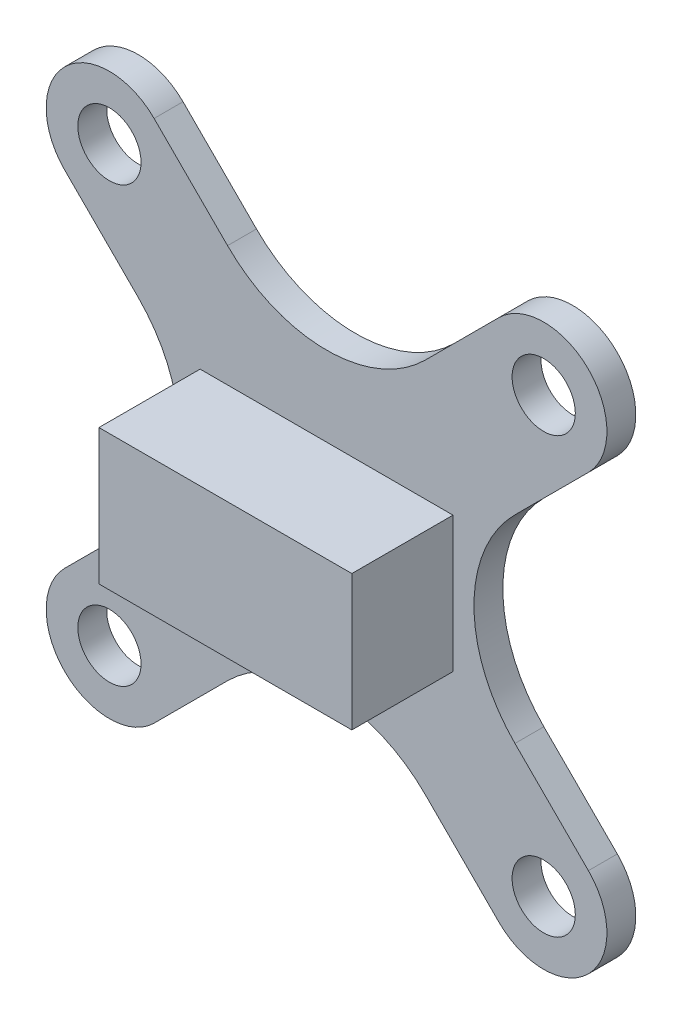
ISO-10303-21;
HEADER;
FILE_DESCRIPTION(('STEP AP214'),'2;1');
FILE_NAME('part.step','',(''),(''),'','','');
FILE_SCHEMA(('AUTOMOTIVE_DESIGN { 1 0 10303 214 1 1 1 1 }'));
ENDSEC;
DATA;
#1=APPLICATION_CONTEXT('core data for automotive mechanical design processes');
#2=APPLICATION_PROTOCOL_DEFINITION('international standard','automotive_design',2000,#1);
#3=PRODUCT_CONTEXT('',#1,'mechanical');
#4=PRODUCT('Part','Part','',(#3));
#5=PRODUCT_RELATED_PRODUCT_CATEGORY('part','',(#4));
#6=PRODUCT_DEFINITION_FORMATION('','',#4);
#7=PRODUCT_DEFINITION_CONTEXT('part definition',#1,'design');
#8=PRODUCT_DEFINITION('design','',#6,#7);
#9=PRODUCT_DEFINITION_SHAPE('','',#8);
#10=(LENGTH_UNIT() NAMED_UNIT(*) SI_UNIT(.MILLI.,.METRE.));
#11=(NAMED_UNIT(*) PLANE_ANGLE_UNIT() SI_UNIT($,.RADIAN.));
#12=(NAMED_UNIT(*) SI_UNIT($,.STERADIAN.) SOLID_ANGLE_UNIT());
#13=UNCERTAINTY_MEASURE_WITH_UNIT(LENGTH_MEASURE(1.E-05),#10,'distance_accuracy_value','');
#14=(GEOMETRIC_REPRESENTATION_CONTEXT(3) GLOBAL_UNCERTAINTY_ASSIGNED_CONTEXT((#13)) GLOBAL_UNIT_ASSIGNED_CONTEXT((#10,
#11,#12)) REPRESENTATION_CONTEXT('',''));
#15=CARTESIAN_POINT('',(0.,0.,0.));
#16=DIRECTION('',(0.,0.,1.));
#17=DIRECTION('',(1.,0.,0.));
#18=AXIS2_PLACEMENT_3D('',#15,#16,#17);
#19=CARTESIAN_POINT('',(0.,0.,0.));
#20=DIRECTION('',(0.,0.,1.));
#21=DIRECTION('',(1.,0.,0.));
#22=AXIS2_PLACEMENT_3D('',#19,#20,#21);
#23=PLANE('',#22);
#24=DIRECTION('',(-0.707106781186548,0.707106781186547,0.));
#25=VECTOR('',#24,1.);
#26=CARTESIAN_POINT('',(-2.47487373415295,-2.47487373415295,0.));
#27=LINE('',#26,#25);
#28=CARTESIAN_POINT('',(-10.4298250225015,5.48007755419563,0.));
#29=VERTEX_POINT('',#28);
#30=CARTESIAN_POINT('',(-14.4956890143243,9.54594154601834,0.));
#31=VERTEX_POINT('',#30);
#32=EDGE_CURVE('E424',#29,#31,#27,.T.);
#33=ORIENTED_EDGE('',*,*,#32,.T.);
#34=CARTESIAN_POINT('',(-12.0208152801714,12.0208152801712,0.));
#35=DIRECTION('',(0.,0.,1.));
#36=DIRECTION('',(1.,0.,0.));
#37=AXIS2_PLACEMENT_3D('',#34,#35,#36);
#38=CIRCLE('',#37,3.5);
#39=CARTESIAN_POINT('',(-9.54594154601845,14.4956890143242,0.));
#40=VERTEX_POINT('',#39);
#41=EDGE_CURVE('E331',#31,#40,#38,.F.);
#42=ORIENTED_EDGE('',*,*,#41,.T.);
#43=DIRECTION('',(0.707106781186549,-0.707106781186546,0.));
#44=VECTOR('',#43,1.);
#45=CARTESIAN_POINT('',(2.47487373415289,2.4748737341529,0.));
#46=LINE('',#45,#44);
#47=CARTESIAN_POINT('',(-5.48007755419572,10.4298250225015,0.));
#48=VERTEX_POINT('',#47);
#49=EDGE_CURVE('E477',#40,#48,#46,.T.);
#50=ORIENTED_EDGE('',*,*,#49,.T.);
#51=CARTESIAN_POINT('',(0.,15.9099025766972,0.));
#52=DIRECTION('',(0.,0.,1.));
#53=DIRECTION('',(1.,0.,0.));
#54=AXIS2_PLACEMENT_3D('',#51,#52,#53);
#55=CIRCLE('',#54,7.74999999999999);
#56=CARTESIAN_POINT('',(5.48007755419572,10.4298250225015,0.));
#57=VERTEX_POINT('',#56);
#58=EDGE_CURVE('E478',#48,#57,#55,.T.);
#59=ORIENTED_EDGE('',*,*,#58,.T.);
#60=DIRECTION('',(-0.707106781186551,-0.707106781186544,0.));
#61=VECTOR('',#60,1.);
#62=CARTESIAN_POINT('',(-2.47487373415291,2.47487373415294,0.));
#63=LINE('',#62,#61);
#64=CARTESIAN_POINT('',(9.54594154601845,14.4956890143242,0.));
#65=VERTEX_POINT('',#64);
#66=EDGE_CURVE('E472',#65,#57,#63,.T.);
#67=ORIENTED_EDGE('',*,*,#66,.F.);
#68=CARTESIAN_POINT('',(12.0208152801714,12.0208152801712,0.));
#69=DIRECTION('',(0.,0.,1.));
#70=DIRECTION('',(1.,0.,0.));
#71=AXIS2_PLACEMENT_3D('',#68,#69,#70);
#72=CIRCLE('',#71,3.5);
#73=CARTESIAN_POINT('',(14.4956890143243,9.54594154601834,0.));
#74=VERTEX_POINT('',#73);
#75=EDGE_CURVE('E470',#74,#65,#72,.T.);
#76=ORIENTED_EDGE('',*,*,#75,.F.);
#77=DIRECTION('',(0.70710678118657,0.707106781186525,0.));
#78=VECTOR('',#77,1.);
#79=CARTESIAN_POINT('',(2.4748737341525,-2.47487373415266,0.));
#80=LINE('',#79,#78);
#81=CARTESIAN_POINT('',(10.4298250225015,5.4800775541958,0.));
#82=VERTEX_POINT('',#81);
#83=EDGE_CURVE('E463',#82,#74,#80,.T.);
#84=ORIENTED_EDGE('',*,*,#83,.F.);
#85=CARTESIAN_POINT('',(15.9099025766973,1.28369537222284E-13,0.));
#86=DIRECTION('',(0.,0.,1.));
#87=DIRECTION('',(1.,0.,0.));
#88=AXIS2_PLACEMENT_3D('',#85,#86,#87);
#89=CIRCLE('',#88,7.74999999999999);
#90=CARTESIAN_POINT('',(10.4298250225015,-5.48007755419564,0.));
#91=VERTEX_POINT('',#90);
#92=EDGE_CURVE('E458',#82,#91,#89,.T.);
#93=ORIENTED_EDGE('',*,*,#92,.T.);
#94=DIRECTION('',(0.707106781186548,-0.707106781186547,0.));
#95=VECTOR('',#94,1.);
#96=CARTESIAN_POINT('',(2.47487373415294,2.47487373415295,0.));
#97=LINE('',#96,#95);
#98=CARTESIAN_POINT('',(14.4956890143243,-9.54594154601834,0.));
#99=VERTEX_POINT('',#98);
#100=EDGE_CURVE('E457',#91,#99,#97,.T.);
#101=ORIENTED_EDGE('',*,*,#100,.T.);
#102=CARTESIAN_POINT('',(12.0208152801714,-12.0208152801712,0.));
#103=DIRECTION('',(0.,0.,1.));
#104=DIRECTION('',(1.,0.,0.));
#105=AXIS2_PLACEMENT_3D('',#102,#103,#104);
#106=CIRCLE('',#105,3.5);
#107=CARTESIAN_POINT('',(9.54594154601845,-14.4956890143242,0.));
#108=VERTEX_POINT('',#107);
#109=EDGE_CURVE('E451',#99,#108,#106,.F.);
#110=ORIENTED_EDGE('',*,*,#109,.T.);
#111=DIRECTION('',(-0.707106781186551,0.707106781186544,0.));
#112=VECTOR('',#111,1.);
#113=CARTESIAN_POINT('',(-2.47487373415291,-2.47487373415294,0.));
#114=LINE('',#113,#112);
#115=CARTESIAN_POINT('',(5.48007755419572,-10.4298250225015,0.));
#116=VERTEX_POINT('',#115);
#117=EDGE_CURVE('E447',#108,#116,#114,.T.);
#118=ORIENTED_EDGE('',*,*,#117,.T.);
#119=CARTESIAN_POINT('',(0.,-15.9099025766973,0.));
#120=DIRECTION('',(0.,0.,1.));
#121=DIRECTION('',(1.,0.,0.));
#122=AXIS2_PLACEMENT_3D('',#119,#120,#121);
#123=CIRCLE('',#122,7.74999999999999);
#124=CARTESIAN_POINT('',(-5.48007755419571,-10.4298250225015,0.));
#125=VERTEX_POINT('',#124);
#126=EDGE_CURVE('E441',#125,#116,#123,.F.);
#127=ORIENTED_EDGE('',*,*,#126,.F.);
#128=DIRECTION('',(0.707106781186551,0.707106781186544,0.));
#129=VECTOR('',#128,1.);
#130=CARTESIAN_POINT('',(2.47487373415292,-2.47487373415295,0.));
#131=LINE('',#130,#129);
#132=CARTESIAN_POINT('',(-9.54594154601845,-14.4956890143242,0.));
#133=VERTEX_POINT('',#132);
#134=EDGE_CURVE('E439',#133,#125,#131,.T.);
#135=ORIENTED_EDGE('',*,*,#134,.F.);
#136=CARTESIAN_POINT('',(-12.0208152801714,-12.0208152801712,0.));
#137=DIRECTION('',(0.,0.,1.));
#138=DIRECTION('',(1.,0.,0.));
#139=AXIS2_PLACEMENT_3D('',#136,#137,#138);
#140=CIRCLE('',#139,3.49999999999999);
#141=CARTESIAN_POINT('',(-14.4956890143243,-9.54594154601835,0.));
#142=VERTEX_POINT('',#141);
#143=EDGE_CURVE('E436',#142,#133,#140,.T.);
#144=ORIENTED_EDGE('',*,*,#143,.F.);
#145=DIRECTION('',(-0.70710678118657,-0.707106781186525,0.));
#146=VECTOR('',#145,1.);
#147=CARTESIAN_POINT('',(-2.4748737341525,2.47487373415265,0.));
#148=LINE('',#147,#146);
#149=CARTESIAN_POINT('',(-10.4298250225015,-5.48007755419581,0.));
#150=VERTEX_POINT('',#149);
#151=EDGE_CURVE('E435',#150,#142,#148,.T.);
#152=ORIENTED_EDGE('',*,*,#151,.F.);
#153=CARTESIAN_POINT('',(-15.9099025766973,-1.35308431126191E-13,0.));
#154=DIRECTION('',(0.,0.,1.));
#155=DIRECTION('',(1.,0.,0.));
#156=AXIS2_PLACEMENT_3D('',#153,#154,#155);
#157=CIRCLE('',#156,7.75);
#158=EDGE_CURVE('E428',#29,#150,#157,.F.);
#159=ORIENTED_EDGE('',*,*,#158,.F.);
#160=EDGE_LOOP('',(#33,#42,#50,#59,#67,#76,#84,#93,#101,#110,#118,#127,#135,#144,#152,#159));
#161=FACE_BOUND('',#160,.T.);
#162=CARTESIAN_POINT('',(12.0208152801714,-12.0208152801712,0.));
#163=DIRECTION('',(0.,0.,1.));
#164=DIRECTION('',(1.,0.,0.));
#165=AXIS2_PLACEMENT_3D('',#162,#163,#164);
#166=CIRCLE('',#165,1.75);
#167=CARTESIAN_POINT('',(13.7708152801714,-12.0208152801712,0.));
#168=VERTEX_POINT('',#167);
#169=EDGE_CURVE('E419',#168,#168,#166,.T.);
#170=ORIENTED_EDGE('',*,*,#169,.T.);
#171=EDGE_LOOP('',(#170));
#172=FACE_BOUND('',#171,.T.);
#173=CARTESIAN_POINT('',(12.0208152801714,12.0208152801712,0.));
#174=DIRECTION('',(0.,0.,1.));
#175=DIRECTION('',(1.,0.,0.));
#176=AXIS2_PLACEMENT_3D('',#173,#174,#175);
#177=CIRCLE('',#176,1.75);
#178=CARTESIAN_POINT('',(13.7708152801714,12.0208152801712,0.));
#179=VERTEX_POINT('',#178);
#180=EDGE_CURVE('E418',#179,#179,#177,.F.);
#181=ORIENTED_EDGE('',*,*,#180,.F.);
#182=EDGE_LOOP('',(#181));
#183=FACE_BOUND('',#182,.T.);
#184=CARTESIAN_POINT('',(-12.0208152801714,12.0208152801713,0.));
#185=DIRECTION('',(0.,0.,1.));
#186=DIRECTION('',(1.,0.,0.));
#187=AXIS2_PLACEMENT_3D('',#184,#185,#186);
#188=CIRCLE('',#187,1.74999999999998);
#189=CARTESIAN_POINT('',(-10.2708152801714,12.0208152801713,0.));
#190=VERTEX_POINT('',#189);
#191=EDGE_CURVE('E411',#190,#190,#188,.T.);
#192=ORIENTED_EDGE('',*,*,#191,.T.);
#193=EDGE_LOOP('',(#192));
#194=FACE_BOUND('',#193,.T.);
#195=CARTESIAN_POINT('',(-12.0208152801714,-12.0208152801712,0.));
#196=DIRECTION('',(0.,0.,1.));
#197=DIRECTION('',(1.,0.,0.));
#198=AXIS2_PLACEMENT_3D('',#195,#196,#197);
#199=CIRCLE('',#198,1.75);
#200=CARTESIAN_POINT('',(-10.2708152801714,-12.0208152801712,0.));
#201=VERTEX_POINT('',#200);
#202=EDGE_CURVE('E327',#201,#201,#199,.F.);
#203=ORIENTED_EDGE('',*,*,#202,.F.);
#204=EDGE_LOOP('',(#203));
#205=FACE_BOUND('',#204,.T.);
#206=DIRECTION('',(0.,-1.,0.));
#207=VECTOR('',#206,1.);
#208=CARTESIAN_POINT('',(2.5,0.,0.));
#209=LINE('',#208,#207);
#210=CARTESIAN_POINT('',(2.5,2.,0.));
#211=VERTEX_POINT('',#210);
#212=CARTESIAN_POINT('',(2.5,-2.,0.));
#213=VERTEX_POINT('',#212);
#214=EDGE_CURVE('E93',#211,#213,#209,.T.);
#215=ORIENTED_EDGE('',*,*,#214,.F.);
#216=DIRECTION('',(1.,0.,0.));
#217=VECTOR('',#216,1.);
#218=CARTESIAN_POINT('',(0.,2.,0.));
#219=LINE('',#218,#217);
#220=CARTESIAN_POINT('',(-2.5,2.,0.));
#221=VERTEX_POINT('',#220);
#222=EDGE_CURVE('E252',#221,#211,#219,.T.);
#223=ORIENTED_EDGE('',*,*,#222,.F.);
#224=DIRECTION('',(0.,-1.,0.));
#225=VECTOR('',#224,1.);
#226=CARTESIAN_POINT('',(-2.5,0.,0.));
#227=LINE('',#226,#225);
#228=CARTESIAN_POINT('',(-2.5,-2.,0.));
#229=VERTEX_POINT('',#228);
#230=EDGE_CURVE('E264',#221,#229,#227,.T.);
#231=ORIENTED_EDGE('',*,*,#230,.T.);
#232=DIRECTION('',(1.,0.,0.));
#233=VECTOR('',#232,1.);
#234=CARTESIAN_POINT('',(0.,-2.,0.));
#235=LINE('',#234,#233);
#236=EDGE_CURVE('E261',#229,#213,#235,.T.);
#237=ORIENTED_EDGE('',*,*,#236,.T.);
#238=EDGE_LOOP('',(#215,#223,#231,#237));
#239=FACE_BOUND('',#238,.T.);
#240=ADVANCED_FACE('F73',(#161,#172,#183,#194,#205,#239),#23,.F.);
#241=CARTESIAN_POINT('',(-2.47487373415295,-2.47487373415295,1.6));
#242=DIRECTION('',(-0.707106781186547,-0.707106781186548,0.));
#243=DIRECTION('',(0.707106781186548,-0.707106781186547,0.));
#244=AXIS2_PLACEMENT_3D('',#241,#242,#243);
#245=PLANE('',#244);
#246=ORIENTED_EDGE('',*,*,#32,.F.);
#247=DIRECTION('',(0.,0.,-1.));
#248=VECTOR('',#247,1.);
#249=CARTESIAN_POINT('',(-10.4298250225015,5.48007755419563,1.6));
#250=LINE('',#249,#248);
#251=CARTESIAN_POINT('',(-10.4298250225015,5.48007755419563,1.6));
#252=VERTEX_POINT('',#251);
#253=EDGE_CURVE('E12',#252,#29,#250,.T.);
#254=ORIENTED_EDGE('',*,*,#253,.F.);
#255=DIRECTION('',(-0.707106781186548,0.707106781186547,0.));
#256=VECTOR('',#255,1.);
#257=CARTESIAN_POINT('',(-2.47487373415295,-2.47487373415295,1.6));
#258=LINE('',#257,#256);
#259=CARTESIAN_POINT('',(-14.4956890143243,9.54594154601834,1.6));
#260=VERTEX_POINT('',#259);
#261=EDGE_CURVE('E347',#252,#260,#258,.T.);
#262=ORIENTED_EDGE('',*,*,#261,.T.);
#263=DIRECTION('',(0.,0.,-1.));
#264=VECTOR('',#263,1.);
#265=CARTESIAN_POINT('',(-14.4956890143243,9.54594154601834,1.6));
#266=LINE('',#265,#264);
#267=EDGE_CURVE('E407',#260,#31,#266,.T.);
#268=ORIENTED_EDGE('',*,*,#267,.T.);
#269=EDGE_LOOP('',(#246,#254,#262,#268));
#270=FACE_BOUND('',#269,.T.);
#271=ADVANCED_FACE('F550',(#270),#245,.T.);
#272=CARTESIAN_POINT('',(-15.9099025766973,-1.35308431126191E-13,1.6));
#273=DIRECTION('',(0.,0.,-1.));
#274=DIRECTION('',(-1.,0.,0.));
#275=AXIS2_PLACEMENT_3D('',#272,#273,#274);
#276=CYLINDRICAL_SURFACE('',#275,7.75);
#277=ORIENTED_EDGE('',*,*,#158,.T.);
#278=DIRECTION('',(0.,0.,-1.));
#279=VECTOR('',#278,1.);
#280=CARTESIAN_POINT('',(-10.4298250225015,-5.48007755419581,1.6));
#281=LINE('',#280,#279);
#282=CARTESIAN_POINT('',(-10.4298250225015,-5.48007755419581,1.6));
#283=VERTEX_POINT('',#282);
#284=EDGE_CURVE('E83',#283,#150,#281,.T.);
#285=ORIENTED_EDGE('',*,*,#284,.F.);
#286=CARTESIAN_POINT('',(-15.9099025766973,-1.35308431126191E-13,1.6));
#287=DIRECTION('',(0.,0.,1.));
#288=DIRECTION('',(1.,0.,0.));
#289=AXIS2_PLACEMENT_3D('',#286,#287,#288);
#290=CIRCLE('',#289,7.75);
#291=EDGE_CURVE('E348',#252,#283,#290,.F.);
#292=ORIENTED_EDGE('',*,*,#291,.F.);
#293=ORIENTED_EDGE('',*,*,#253,.T.);
#294=EDGE_LOOP('',(#277,#285,#292,#293));
#295=FACE_BOUND('',#294,.T.);
#296=ADVANCED_FACE('F541',(#295),#276,.F.);
#297=CARTESIAN_POINT('',(-2.4748737341525,2.47487373415265,1.6));
#298=DIRECTION('',(0.707106781186525,-0.70710678118657,0.));
#299=DIRECTION('',(0.70710678118657,0.707106781186525,0.));
#300=AXIS2_PLACEMENT_3D('',#297,#298,#299);
#301=PLANE('',#300);
#302=ORIENTED_EDGE('',*,*,#151,.T.);
#303=DIRECTION('',(0.,0.,-1.));
#304=VECTOR('',#303,1.);
#305=CARTESIAN_POINT('',(-14.4956890143243,-9.54594154601835,1.6));
#306=LINE('',#305,#304);
#307=CARTESIAN_POINT('',(-14.4956890143243,-9.54594154601835,1.6));
#308=VERTEX_POINT('',#307);
#309=EDGE_CURVE('E530',#308,#142,#306,.T.);
#310=ORIENTED_EDGE('',*,*,#309,.F.);
#311=DIRECTION('',(-0.70710678118657,-0.707106781186525,0.));
#312=VECTOR('',#311,1.);
#313=CARTESIAN_POINT('',(-2.4748737341525,2.47487373415265,1.6));
#314=LINE('',#313,#312);
#315=EDGE_CURVE('E353',#283,#308,#314,.T.);
#316=ORIENTED_EDGE('',*,*,#315,.F.);
#317=ORIENTED_EDGE('',*,*,#284,.T.);
#318=EDGE_LOOP('',(#302,#310,#316,#317));
#319=FACE_BOUND('',#318,.T.);
#320=ADVANCED_FACE('F536',(#319),#301,.F.);
#321=CARTESIAN_POINT('',(-12.0208152801714,-12.0208152801712,1.6));
#322=DIRECTION('',(0.,0.,-1.));
#323=DIRECTION('',(-1.,0.,0.));
#324=AXIS2_PLACEMENT_3D('',#321,#322,#323);
#325=CYLINDRICAL_SURFACE('',#324,3.49999999999999);
#326=ORIENTED_EDGE('',*,*,#143,.T.);
#327=DIRECTION('',(0.,0.,-1.));
#328=VECTOR('',#327,1.);
#329=CARTESIAN_POINT('',(-9.54594154601845,-14.4956890143242,1.6));
#330=LINE('',#329,#328);
#331=CARTESIAN_POINT('',(-9.54594154601845,-14.4956890143242,1.6));
#332=VERTEX_POINT('',#331);
#333=EDGE_CURVE('E522',#332,#133,#330,.T.);
#334=ORIENTED_EDGE('',*,*,#333,.F.);
#335=CARTESIAN_POINT('',(-12.0208152801714,-12.0208152801712,1.6));
#336=DIRECTION('',(0.,0.,1.));
#337=DIRECTION('',(1.,0.,0.));
#338=AXIS2_PLACEMENT_3D('',#335,#336,#337);
#339=CIRCLE('',#338,3.49999999999999);
#340=EDGE_CURVE('E360',#308,#332,#339,.T.);
#341=ORIENTED_EDGE('',*,*,#340,.F.);
#342=ORIENTED_EDGE('',*,*,#309,.T.);
#343=EDGE_LOOP('',(#326,#334,#341,#342));
#344=FACE_BOUND('',#343,.T.);
#345=ADVANCED_FACE('F594',(#344),#325,.T.);
#346=CARTESIAN_POINT('',(2.47487373415292,-2.47487373415295,1.6));
#347=DIRECTION('',(-0.707106781186544,0.707106781186551,0.));
#348=DIRECTION('',(-0.707106781186551,-0.707106781186544,0.));
#349=AXIS2_PLACEMENT_3D('',#346,#347,#348);
#350=PLANE('',#349);
#351=ORIENTED_EDGE('',*,*,#134,.T.);
#352=DIRECTION('',(0.,0.,-1.));
#353=VECTOR('',#352,1.);
#354=CARTESIAN_POINT('',(-5.48007755419571,-10.4298250225015,1.6));
#355=LINE('',#354,#353);
#356=CARTESIAN_POINT('',(-5.48007755419571,-10.4298250225015,1.6));
#357=VERTEX_POINT('',#356);
#358=EDGE_CURVE('E524',#357,#125,#355,.T.);
#359=ORIENTED_EDGE('',*,*,#358,.F.);
#360=DIRECTION('',(0.707106781186551,0.707106781186544,0.));
#361=VECTOR('',#360,1.);
#362=CARTESIAN_POINT('',(2.47487373415292,-2.47487373415295,1.6));
#363=LINE('',#362,#361);
#364=EDGE_CURVE('E362',#332,#357,#363,.T.);
#365=ORIENTED_EDGE('',*,*,#364,.F.);
#366=ORIENTED_EDGE('',*,*,#333,.T.);
#367=EDGE_LOOP('',(#351,#359,#365,#366));
#368=FACE_BOUND('',#367,.T.);
#369=ADVANCED_FACE('F595',(#368),#350,.F.);
#370=CARTESIAN_POINT('',(0.,-15.9099025766973,1.6));
#371=DIRECTION('',(0.,0.,-1.));
#372=DIRECTION('',(-1.,0.,0.));
#373=AXIS2_PLACEMENT_3D('',#370,#371,#372);
#374=CYLINDRICAL_SURFACE('',#373,7.74999999999999);
#375=ORIENTED_EDGE('',*,*,#126,.T.);
#376=DIRECTION('',(0.,0.,-1.));
#377=VECTOR('',#376,1.);
#378=CARTESIAN_POINT('',(5.48007755419572,-10.4298250225015,1.6));
#379=LINE('',#378,#377);
#380=CARTESIAN_POINT('',(5.48007755419572,-10.4298250225015,1.6));
#381=VERTEX_POINT('',#380);
#382=EDGE_CURVE('E517',#381,#116,#379,.T.);
#383=ORIENTED_EDGE('',*,*,#382,.F.);
#384=CARTESIAN_POINT('',(0.,-15.9099025766973,1.6));
#385=DIRECTION('',(0.,0.,1.));
#386=DIRECTION('',(1.,0.,0.));
#387=AXIS2_PLACEMENT_3D('',#384,#385,#386);
#388=CIRCLE('',#387,7.74999999999999);
#389=EDGE_CURVE('E368',#357,#381,#388,.F.);
#390=ORIENTED_EDGE('',*,*,#389,.F.);
#391=ORIENTED_EDGE('',*,*,#358,.T.);
#392=EDGE_LOOP('',(#375,#383,#390,#391));
#393=FACE_BOUND('',#392,.T.);
#394=ADVANCED_FACE('F587',(#393),#374,.F.);
#395=CARTESIAN_POINT('',(-2.47487373415291,-2.47487373415294,1.6));
#396=DIRECTION('',(-0.707106781186545,-0.707106781186551,0.));
#397=DIRECTION('',(0.707106781186551,-0.707106781186545,0.));
#398=AXIS2_PLACEMENT_3D('',#395,#396,#397);
#399=PLANE('',#398);
#400=ORIENTED_EDGE('',*,*,#117,.F.);
#401=DIRECTION('',(0.,0.,-1.));
#402=VECTOR('',#401,1.);
#403=CARTESIAN_POINT('',(9.54594154601845,-14.4956890143242,1.6));
#404=LINE('',#403,#402);
#405=CARTESIAN_POINT('',(9.54594154601845,-14.4956890143242,1.6));
#406=VERTEX_POINT('',#405);
#407=EDGE_CURVE('E513',#406,#108,#404,.T.);
#408=ORIENTED_EDGE('',*,*,#407,.F.);
#409=DIRECTION('',(-0.707106781186551,0.707106781186544,0.));
#410=VECTOR('',#409,1.);
#411=CARTESIAN_POINT('',(-2.47487373415291,-2.47487373415294,1.6));
#412=LINE('',#411,#410);
#413=EDGE_CURVE('E369',#406,#381,#412,.T.);
#414=ORIENTED_EDGE('',*,*,#413,.T.);
#415=ORIENTED_EDGE('',*,*,#382,.T.);
#416=EDGE_LOOP('',(#400,#408,#414,#415));
#417=FACE_BOUND('',#416,.T.);
#418=ADVANCED_FACE('F588',(#417),#399,.T.);
#419=CARTESIAN_POINT('',(12.0208152801714,-12.0208152801712,1.6));
#420=DIRECTION('',(0.,0.,-1.));
#421=DIRECTION('',(-1.,0.,0.));
#422=AXIS2_PLACEMENT_3D('',#419,#420,#421);
#423=CYLINDRICAL_SURFACE('',#422,3.5);
#424=ORIENTED_EDGE('',*,*,#109,.F.);
#425=DIRECTION('',(0.,0.,-1.));
#426=VECTOR('',#425,1.);
#427=CARTESIAN_POINT('',(14.4956890143243,-9.54594154601834,1.6));
#428=LINE('',#427,#426);
#429=CARTESIAN_POINT('',(14.4956890143243,-9.54594154601834,1.6));
#430=VERTEX_POINT('',#429);
#431=EDGE_CURVE('E515',#430,#99,#428,.T.);
#432=ORIENTED_EDGE('',*,*,#431,.F.);
#433=CARTESIAN_POINT('',(12.0208152801714,-12.0208152801712,1.6));
#434=DIRECTION('',(0.,0.,1.));
#435=DIRECTION('',(1.,0.,0.));
#436=AXIS2_PLACEMENT_3D('',#433,#434,#435);
#437=CIRCLE('',#436,3.5);
#438=EDGE_CURVE('E373',#430,#406,#437,.F.);
#439=ORIENTED_EDGE('',*,*,#438,.T.);
#440=ORIENTED_EDGE('',*,*,#407,.T.);
#441=EDGE_LOOP('',(#424,#432,#439,#440));
#442=FACE_BOUND('',#441,.T.);
#443=ADVANCED_FACE('F582',(#442),#423,.T.);
#444=CARTESIAN_POINT('',(2.47487373415294,2.47487373415295,1.6));
#445=DIRECTION('',(0.707106781186547,0.707106781186548,0.));
#446=DIRECTION('',(-0.707106781186548,0.707106781186547,0.));
#447=AXIS2_PLACEMENT_3D('',#444,#445,#446);
#448=PLANE('',#447);
#449=ORIENTED_EDGE('',*,*,#100,.F.);
#450=DIRECTION('',(0.,0.,-1.));
#451=VECTOR('',#450,1.);
#452=CARTESIAN_POINT('',(10.4298250225015,-5.48007755419564,1.6));
#453=LINE('',#452,#451);
#454=CARTESIAN_POINT('',(10.4298250225015,-5.48007755419564,1.6));
#455=VERTEX_POINT('',#454);
#456=EDGE_CURVE('E508',#455,#91,#453,.T.);
#457=ORIENTED_EDGE('',*,*,#456,.F.);
#458=DIRECTION('',(0.707106781186548,-0.707106781186547,0.));
#459=VECTOR('',#458,1.);
#460=CARTESIAN_POINT('',(2.47487373415294,2.47487373415295,1.6));
#461=LINE('',#460,#459);
#462=EDGE_CURVE('E380',#455,#430,#461,.T.);
#463=ORIENTED_EDGE('',*,*,#462,.T.);
#464=ORIENTED_EDGE('',*,*,#431,.T.);
#465=EDGE_LOOP('',(#449,#457,#463,#464));
#466=FACE_BOUND('',#465,.T.);
#467=ADVANCED_FACE('F580',(#466),#448,.T.);
#468=CARTESIAN_POINT('',(15.9099025766973,1.28369537222284E-13,1.6));
#469=DIRECTION('',(0.,0.,-1.));
#470=DIRECTION('',(-1.,0.,0.));
#471=AXIS2_PLACEMENT_3D('',#468,#469,#470);
#472=CYLINDRICAL_SURFACE('',#471,7.74999999999999);
#473=ORIENTED_EDGE('',*,*,#92,.F.);
#474=DIRECTION('',(0.,0.,-1.));
#475=VECTOR('',#474,1.);
#476=CARTESIAN_POINT('',(10.4298250225015,5.4800775541958,1.6));
#477=LINE('',#476,#475);
#478=CARTESIAN_POINT('',(10.4298250225015,5.4800775541958,1.6));
#479=VERTEX_POINT('',#478);
#480=EDGE_CURVE('E509',#479,#82,#477,.T.);
#481=ORIENTED_EDGE('',*,*,#480,.F.);
#482=CARTESIAN_POINT('',(15.9099025766973,1.28369537222284E-13,1.6));
#483=DIRECTION('',(0.,0.,1.));
#484=DIRECTION('',(1.,0.,0.));
#485=AXIS2_PLACEMENT_3D('',#482,#483,#484);
#486=CIRCLE('',#485,7.74999999999999);
#487=EDGE_CURVE('E381',#479,#455,#486,.T.);
#488=ORIENTED_EDGE('',*,*,#487,.T.);
#489=ORIENTED_EDGE('',*,*,#456,.T.);
#490=EDGE_LOOP('',(#473,#481,#488,#489));
#491=FACE_BOUND('',#490,.T.);
#492=ADVANCED_FACE('F573',(#491),#472,.F.);
#493=CARTESIAN_POINT('',(2.4748737341525,-2.47487373415266,1.6));
#494=DIRECTION('',(-0.707106781186525,0.70710678118657,0.));
#495=DIRECTION('',(-0.70710678118657,-0.707106781186525,0.));
#496=AXIS2_PLACEMENT_3D('',#493,#494,#495);
#497=PLANE('',#496);
#498=ORIENTED_EDGE('',*,*,#83,.T.);
#499=DIRECTION('',(0.,0.,-1.));
#500=VECTOR('',#499,1.);
#501=CARTESIAN_POINT('',(14.4956890143243,9.54594154601834,1.6));
#502=LINE('',#501,#500);
#503=CARTESIAN_POINT('',(14.4956890143243,9.54594154601834,1.6));
#504=VERTEX_POINT('',#503);
#505=EDGE_CURVE('E505',#504,#74,#502,.T.);
#506=ORIENTED_EDGE('',*,*,#505,.F.);
#507=DIRECTION('',(0.70710678118657,0.707106781186525,0.));
#508=VECTOR('',#507,1.);
#509=CARTESIAN_POINT('',(2.4748737341525,-2.47487373415266,1.6));
#510=LINE('',#509,#508);
#511=EDGE_CURVE('E384',#479,#504,#510,.T.);
#512=ORIENTED_EDGE('',*,*,#511,.F.);
#513=ORIENTED_EDGE('',*,*,#480,.T.);
#514=EDGE_LOOP('',(#498,#506,#512,#513));
#515=FACE_BOUND('',#514,.T.);
#516=ADVANCED_FACE('F571',(#515),#497,.F.);
#517=CARTESIAN_POINT('',(12.0208152801714,12.0208152801712,1.6));
#518=DIRECTION('',(0.,0.,-1.));
#519=DIRECTION('',(-1.,0.,0.));
#520=AXIS2_PLACEMENT_3D('',#517,#518,#519);
#521=CYLINDRICAL_SURFACE('',#520,3.5);
#522=ORIENTED_EDGE('',*,*,#75,.T.);
#523=DIRECTION('',(0.,0.,-1.));
#524=VECTOR('',#523,1.);
#525=CARTESIAN_POINT('',(9.54594154601845,14.4956890143242,1.6));
#526=LINE('',#525,#524);
#527=CARTESIAN_POINT('',(9.54594154601845,14.4956890143242,1.6));
#528=VERTEX_POINT('',#527);
#529=EDGE_CURVE('E499',#528,#65,#526,.T.);
#530=ORIENTED_EDGE('',*,*,#529,.F.);
#531=CARTESIAN_POINT('',(12.0208152801714,12.0208152801712,1.6));
#532=DIRECTION('',(0.,0.,1.));
#533=DIRECTION('',(1.,0.,0.));
#534=AXIS2_PLACEMENT_3D('',#531,#532,#533);
#535=CIRCLE('',#534,3.5);
#536=EDGE_CURVE('E386',#504,#528,#535,.T.);
#537=ORIENTED_EDGE('',*,*,#536,.F.);
#538=ORIENTED_EDGE('',*,*,#505,.T.);
#539=EDGE_LOOP('',(#522,#530,#537,#538));
#540=FACE_BOUND('',#539,.T.);
#541=ADVANCED_FACE('F566',(#540),#521,.T.);
#542=CARTESIAN_POINT('',(-2.47487373415291,2.47487373415294,1.6));
#543=DIRECTION('',(0.707106781186545,-0.707106781186551,0.));
#544=DIRECTION('',(0.707106781186551,0.707106781186545,0.));
#545=AXIS2_PLACEMENT_3D('',#542,#543,#544);
#546=PLANE('',#545);
#547=ORIENTED_EDGE('',*,*,#66,.T.);
#548=DIRECTION('',(0.,0.,-1.));
#549=VECTOR('',#548,1.);
#550=CARTESIAN_POINT('',(5.48007755419572,10.4298250225015,1.6));
#551=LINE('',#550,#549);
#552=CARTESIAN_POINT('',(5.48007755419572,10.4298250225015,1.6));
#553=VERTEX_POINT('',#552);
#554=EDGE_CURVE('E494',#553,#57,#551,.T.);
#555=ORIENTED_EDGE('',*,*,#554,.F.);
#556=DIRECTION('',(-0.707106781186551,-0.707106781186544,0.));
#557=VECTOR('',#556,1.);
#558=CARTESIAN_POINT('',(-2.47487373415291,2.47487373415294,1.6));
#559=LINE('',#558,#557);
#560=EDGE_CURVE('E392',#528,#553,#559,.T.);
#561=ORIENTED_EDGE('',*,*,#560,.F.);
#562=ORIENTED_EDGE('',*,*,#529,.T.);
#563=EDGE_LOOP('',(#547,#555,#561,#562));
#564=FACE_BOUND('',#563,.T.);
#565=ADVANCED_FACE('F561',(#564),#546,.F.);
#566=CARTESIAN_POINT('',(0.,15.9099025766972,1.6));
#567=DIRECTION('',(0.,0.,-1.));
#568=DIRECTION('',(-1.,0.,0.));
#569=AXIS2_PLACEMENT_3D('',#566,#567,#568);
#570=CYLINDRICAL_SURFACE('',#569,7.74999999999999);
#571=ORIENTED_EDGE('',*,*,#58,.F.);
#572=DIRECTION('',(0.,0.,-1.));
#573=VECTOR('',#572,1.);
#574=CARTESIAN_POINT('',(-5.48007755419572,10.4298250225015,1.6));
#575=LINE('',#574,#573);
#576=CARTESIAN_POINT('',(-5.48007755419572,10.4298250225015,1.6));
#577=VERTEX_POINT('',#576);
#578=EDGE_CURVE('E495',#577,#48,#575,.T.);
#579=ORIENTED_EDGE('',*,*,#578,.F.);
#580=CARTESIAN_POINT('',(0.,15.9099025766972,1.6));
#581=DIRECTION('',(0.,0.,1.));
#582=DIRECTION('',(1.,0.,0.));
#583=AXIS2_PLACEMENT_3D('',#580,#581,#582);
#584=CIRCLE('',#583,7.74999999999999);
#585=EDGE_CURVE('E399',#577,#553,#584,.T.);
#586=ORIENTED_EDGE('',*,*,#585,.T.);
#587=ORIENTED_EDGE('',*,*,#554,.T.);
#588=EDGE_LOOP('',(#571,#579,#586,#587));
#589=FACE_BOUND('',#588,.T.);
#590=ADVANCED_FACE('F558',(#589),#570,.F.);
#591=CARTESIAN_POINT('',(2.47487373415289,2.4748737341529,1.6));
#592=DIRECTION('',(0.707106781186546,0.707106781186549,0.));
#593=DIRECTION('',(-0.707106781186549,0.707106781186546,0.));
#594=AXIS2_PLACEMENT_3D('',#591,#592,#593);
#595=PLANE('',#594);
#596=ORIENTED_EDGE('',*,*,#49,.F.);
#597=DIRECTION('',(0.,0.,-1.));
#598=VECTOR('',#597,1.);
#599=CARTESIAN_POINT('',(-9.54594154601845,14.4956890143242,1.6));
#600=LINE('',#599,#598);
#601=CARTESIAN_POINT('',(-9.54594154601845,14.4956890143242,1.6));
#602=VERTEX_POINT('',#601);
#603=EDGE_CURVE('E487',#602,#40,#600,.T.);
#604=ORIENTED_EDGE('',*,*,#603,.F.);
#605=DIRECTION('',(0.707106781186549,-0.707106781186546,0.));
#606=VECTOR('',#605,1.);
#607=CARTESIAN_POINT('',(2.47487373415289,2.4748737341529,1.6));
#608=LINE('',#607,#606);
#609=EDGE_CURVE('E397',#602,#577,#608,.T.);
#610=ORIENTED_EDGE('',*,*,#609,.T.);
#611=ORIENTED_EDGE('',*,*,#578,.T.);
#612=EDGE_LOOP('',(#596,#604,#610,#611));
#613=FACE_BOUND('',#612,.T.);
#614=ADVANCED_FACE('F553',(#613),#595,.T.);
#615=CARTESIAN_POINT('',(-12.0208152801714,12.0208152801712,1.6));
#616=DIRECTION('',(0.,0.,-1.));
#617=DIRECTION('',(-1.,0.,0.));
#618=AXIS2_PLACEMENT_3D('',#615,#616,#617);
#619=CYLINDRICAL_SURFACE('',#618,3.5);
#620=ORIENTED_EDGE('',*,*,#41,.F.);
#621=ORIENTED_EDGE('',*,*,#267,.F.);
#622=CARTESIAN_POINT('',(-12.0208152801714,12.0208152801712,1.6));
#623=DIRECTION('',(0.,0.,1.));
#624=DIRECTION('',(1.,0.,0.));
#625=AXIS2_PLACEMENT_3D('',#622,#623,#624);
#626=CIRCLE('',#625,3.5);
#627=EDGE_CURVE('E404',#260,#602,#626,.F.);
#628=ORIENTED_EDGE('',*,*,#627,.T.);
#629=ORIENTED_EDGE('',*,*,#603,.T.);
#630=EDGE_LOOP('',(#620,#621,#628,#629));
#631=FACE_BOUND('',#630,.T.);
#632=ADVANCED_FACE('F552',(#631),#619,.T.);
#633=CARTESIAN_POINT('',(12.0208152801714,-12.0208152801712,1.6));
#634=DIRECTION('',(0.,0.,-1.));
#635=DIRECTION('',(-1.,0.,0.));
#636=AXIS2_PLACEMENT_3D('',#633,#634,#635);
#637=CYLINDRICAL_SURFACE('',#636,1.75);
#638=CARTESIAN_POINT('',(12.0208152801714,-12.0208152801712,1.6));
#639=DIRECTION('',(0.,0.,1.));
#640=DIRECTION('',(1.,0.,0.));
#641=AXIS2_PLACEMENT_3D('',#638,#639,#640);
#642=CIRCLE('',#641,1.75);
#643=CARTESIAN_POINT('',(13.7708152801714,-12.0208152801712,1.6));
#644=VERTEX_POINT('',#643);
#645=EDGE_CURVE('E341',#644,#644,#642,.T.);
#646=ORIENTED_EDGE('',*,*,#645,.T.);
#647=EDGE_LOOP('',(#646));
#648=FACE_BOUND('',#647,.T.);
#649=ORIENTED_EDGE('',*,*,#169,.F.);
#650=EDGE_LOOP('',(#649));
#651=FACE_BOUND('',#650,.T.);
#652=ADVANCED_FACE('F622',(#648,#651),#637,.F.);
#653=CARTESIAN_POINT('',(12.0208152801714,12.0208152801712,1.6));
#654=DIRECTION('',(0.,0.,-1.));
#655=DIRECTION('',(-1.,0.,0.));
#656=AXIS2_PLACEMENT_3D('',#653,#654,#655);
#657=CYLINDRICAL_SURFACE('',#656,1.75);
#658=CARTESIAN_POINT('',(12.0208152801714,12.0208152801712,1.6));
#659=DIRECTION('',(0.,0.,1.));
#660=DIRECTION('',(1.,0.,0.));
#661=AXIS2_PLACEMENT_3D('',#658,#659,#660);
#662=CIRCLE('',#661,1.75);
#663=CARTESIAN_POINT('',(13.7708152801714,12.0208152801712,1.6));
#664=VERTEX_POINT('',#663);
#665=EDGE_CURVE('E337',#664,#664,#662,.F.);
#666=ORIENTED_EDGE('',*,*,#665,.F.);
#667=EDGE_LOOP('',(#666));
#668=FACE_BOUND('',#667,.T.);
#669=ORIENTED_EDGE('',*,*,#180,.T.);
#670=EDGE_LOOP('',(#669));
#671=FACE_BOUND('',#670,.T.);
#672=ADVANCED_FACE('F655',(#668,#671),#657,.F.);
#673=CARTESIAN_POINT('',(-12.0208152801714,12.0208152801713,1.6));
#674=DIRECTION('',(0.,0.,-1.));
#675=DIRECTION('',(-1.,0.,0.));
#676=AXIS2_PLACEMENT_3D('',#673,#674,#675);
#677=CYLINDRICAL_SURFACE('',#676,1.74999999999998);
#678=CARTESIAN_POINT('',(-12.0208152801714,12.0208152801713,1.6));
#679=DIRECTION('',(0.,0.,1.));
#680=DIRECTION('',(1.,0.,0.));
#681=AXIS2_PLACEMENT_3D('',#678,#679,#680);
#682=CIRCLE('',#681,1.74999999999998);
#683=CARTESIAN_POINT('',(-10.2708152801714,12.0208152801713,1.6));
#684=VERTEX_POINT('',#683);
#685=EDGE_CURVE('E334',#684,#684,#682,.T.);
#686=ORIENTED_EDGE('',*,*,#685,.T.);
#687=EDGE_LOOP('',(#686));
#688=FACE_BOUND('',#687,.T.);
#689=ORIENTED_EDGE('',*,*,#191,.F.);
#690=EDGE_LOOP('',(#689));
#691=FACE_BOUND('',#690,.T.);
#692=ADVANCED_FACE('F609',(#688,#691),#677,.F.);
#693=CARTESIAN_POINT('',(-12.0208152801714,-12.0208152801712,1.6));
#694=DIRECTION('',(0.,0.,-1.));
#695=DIRECTION('',(-1.,0.,0.));
#696=AXIS2_PLACEMENT_3D('',#693,#694,#695);
#697=CYLINDRICAL_SURFACE('',#696,1.75);
#698=CARTESIAN_POINT('',(-12.0208152801714,-12.0208152801712,1.6));
#699=DIRECTION('',(0.,0.,1.));
#700=DIRECTION('',(1.,0.,0.));
#701=AXIS2_PLACEMENT_3D('',#698,#699,#700);
#702=CIRCLE('',#701,1.75);
#703=CARTESIAN_POINT('',(-10.2708152801714,-12.0208152801712,1.6));
#704=VERTEX_POINT('',#703);
#705=EDGE_CURVE('E328',#704,#704,#702,.F.);
#706=ORIENTED_EDGE('',*,*,#705,.F.);
#707=EDGE_LOOP('',(#706));
#708=FACE_BOUND('',#707,.T.);
#709=ORIENTED_EDGE('',*,*,#202,.T.);
#710=EDGE_LOOP('',(#709));
#711=FACE_BOUND('',#710,.T.);
#712=ADVANCED_FACE('F80',(#708,#711),#697,.F.);
#713=CARTESIAN_POINT('',(0.,0.,1.6));
#714=DIRECTION('',(0.,0.,1.));
#715=DIRECTION('',(1.,0.,0.));
#716=AXIS2_PLACEMENT_3D('',#713,#714,#715);
#717=PLANE('',#716);
#718=DIRECTION('',(-1.,0.,0.));
#719=VECTOR('',#718,1.);
#720=CARTESIAN_POINT('',(0.,3.75,1.6));
#721=LINE('',#720,#719);
#722=CARTESIAN_POINT('',(7.,3.75,1.6));
#723=VERTEX_POINT('',#722);
#724=CARTESIAN_POINT('',(-7.,3.75,1.6));
#725=VERTEX_POINT('',#724);
#726=EDGE_CURVE('E324',#723,#725,#721,.T.);
#727=ORIENTED_EDGE('',*,*,#726,.F.);
#728=DIRECTION('',(0.,1.,0.));
#729=VECTOR('',#728,1.);
#730=CARTESIAN_POINT('',(7.,0.,1.6));
#731=LINE('',#730,#729);
#732=CARTESIAN_POINT('',(7.,-3.75,1.6));
#733=VERTEX_POINT('',#732);
#734=EDGE_CURVE('E316',#733,#723,#731,.T.);
#735=ORIENTED_EDGE('',*,*,#734,.F.);
#736=DIRECTION('',(-1.,0.,0.));
#737=VECTOR('',#736,1.);
#738=CARTESIAN_POINT('',(0.,-3.75,1.6));
#739=LINE('',#738,#737);
#740=CARTESIAN_POINT('',(-7.,-3.75,1.6));
#741=VERTEX_POINT('',#740);
#742=EDGE_CURVE('E319',#733,#741,#739,.T.);
#743=ORIENTED_EDGE('',*,*,#742,.T.);
#744=DIRECTION('',(0.,1.,0.));
#745=VECTOR('',#744,1.);
#746=CARTESIAN_POINT('',(-7.,0.,1.6));
#747=LINE('',#746,#745);
#748=EDGE_CURVE('E97',#741,#725,#747,.T.);
#749=ORIENTED_EDGE('',*,*,#748,.T.);
#750=EDGE_LOOP('',(#727,#735,#743,#749));
#751=FACE_BOUND('',#750,.T.);
#752=ORIENTED_EDGE('',*,*,#705,.T.);
#753=EDGE_LOOP('',(#752));
#754=FACE_BOUND('',#753,.T.);
#755=ORIENTED_EDGE('',*,*,#685,.F.);
#756=EDGE_LOOP('',(#755));
#757=FACE_BOUND('',#756,.T.);
#758=ORIENTED_EDGE('',*,*,#665,.T.);
#759=EDGE_LOOP('',(#758));
#760=FACE_BOUND('',#759,.T.);
#761=ORIENTED_EDGE('',*,*,#645,.F.);
#762=EDGE_LOOP('',(#761));
#763=FACE_BOUND('',#762,.T.);
#764=ORIENTED_EDGE('',*,*,#261,.F.);
#765=ORIENTED_EDGE('',*,*,#291,.T.);
#766=ORIENTED_EDGE('',*,*,#315,.T.);
#767=ORIENTED_EDGE('',*,*,#340,.T.);
#768=ORIENTED_EDGE('',*,*,#364,.T.);
#769=ORIENTED_EDGE('',*,*,#389,.T.);
#770=ORIENTED_EDGE('',*,*,#413,.F.);
#771=ORIENTED_EDGE('',*,*,#438,.F.);
#772=ORIENTED_EDGE('',*,*,#462,.F.);
#773=ORIENTED_EDGE('',*,*,#487,.F.);
#774=ORIENTED_EDGE('',*,*,#511,.T.);
#775=ORIENTED_EDGE('',*,*,#536,.T.);
#776=ORIENTED_EDGE('',*,*,#560,.T.);
#777=ORIENTED_EDGE('',*,*,#585,.F.);
#778=ORIENTED_EDGE('',*,*,#609,.F.);
#779=ORIENTED_EDGE('',*,*,#627,.F.);
#780=EDGE_LOOP('',(#764,#765,#766,#767,#768,#769,#770,#771,#772,#773,#774,#775,#776,#777,#778,#779));
#781=FACE_BOUND('',#780,.T.);
#782=ADVANCED_FACE('F600',(#751,#754,#757,#760,#763,#781),#717,.T.);
#783=CARTESIAN_POINT('',(0.,0.,7.2));
#784=DIRECTION('',(0.,0.,1.));
#785=DIRECTION('',(1.,0.,0.));
#786=AXIS2_PLACEMENT_3D('',#783,#784,#785);
#787=PLANE('',#786);
#788=DIRECTION('',(0.,-1.,0.));
#789=VECTOR('',#788,1.);
#790=CARTESIAN_POINT('',(7.,0.,7.2));
#791=LINE('',#790,#789);
#792=CARTESIAN_POINT('',(7.,3.75,7.2));
#793=VERTEX_POINT('',#792);
#794=CARTESIAN_POINT('',(7.,-3.75,7.2));
#795=VERTEX_POINT('',#794);
#796=EDGE_CURVE('E281',#793,#795,#791,.T.);
#797=ORIENTED_EDGE('',*,*,#796,.F.);
#798=DIRECTION('',(1.,0.,0.));
#799=VECTOR('',#798,1.);
#800=CARTESIAN_POINT('',(0.,3.75,7.2));
#801=LINE('',#800,#799);
#802=CARTESIAN_POINT('',(-7.,3.75,7.2));
#803=VERTEX_POINT('',#802);
#804=EDGE_CURVE('E287',#803,#793,#801,.T.);
#805=ORIENTED_EDGE('',*,*,#804,.F.);
#806=DIRECTION('',(0.,-1.,0.));
#807=VECTOR('',#806,1.);
#808=CARTESIAN_POINT('',(-7.,0.,7.2));
#809=LINE('',#808,#807);
#810=CARTESIAN_POINT('',(-7.,-3.75,7.2));
#811=VERTEX_POINT('',#810);
#812=EDGE_CURVE('E294',#803,#811,#809,.T.);
#813=ORIENTED_EDGE('',*,*,#812,.T.);
#814=DIRECTION('',(1.,0.,0.));
#815=VECTOR('',#814,1.);
#816=CARTESIAN_POINT('',(0.,-3.75,7.2));
#817=LINE('',#816,#815);
#818=EDGE_CURVE('E300',#811,#795,#817,.T.);
#819=ORIENTED_EDGE('',*,*,#818,.T.);
#820=EDGE_LOOP('',(#797,#805,#813,#819));
#821=FACE_BOUND('',#820,.T.);
#822=ADVANCED_FACE('F597',(#821),#787,.T.);
#823=CARTESIAN_POINT('',(7.,0.,7.2));
#824=DIRECTION('',(1.,0.,0.));
#825=DIRECTION('',(0.,0.,-1.));
#826=AXIS2_PLACEMENT_3D('',#823,#824,#825);
#827=PLANE('',#826);
#828=DIRECTION('',(0.,0.,-1.));
#829=VECTOR('',#828,1.);
#830=CARTESIAN_POINT('',(7.,-3.75,7.2));
#831=LINE('',#830,#829);
#832=EDGE_CURVE('E299',#795,#733,#831,.T.);
#833=ORIENTED_EDGE('',*,*,#832,.T.);
#834=ORIENTED_EDGE('',*,*,#734,.T.);
#835=DIRECTION('',(0.,0.,-1.));
#836=VECTOR('',#835,1.);
#837=CARTESIAN_POINT('',(7.,3.75,7.2));
#838=LINE('',#837,#836);
#839=EDGE_CURVE('E315',#793,#723,#838,.T.);
#840=ORIENTED_EDGE('',*,*,#839,.F.);
#841=ORIENTED_EDGE('',*,*,#796,.T.);
#842=EDGE_LOOP('',(#833,#834,#840,#841));
#843=FACE_BOUND('',#842,.T.);
#844=ADVANCED_FACE('F604',(#843),#827,.T.);
#845=CARTESIAN_POINT('',(0.,-3.75,7.2));
#846=DIRECTION('',(0.,1.,0.));
#847=DIRECTION('',(0.,0.,1.));
#848=AXIS2_PLACEMENT_3D('',#845,#846,#847);
#849=PLANE('',#848);
#850=ORIENTED_EDGE('',*,*,#742,.F.);
#851=ORIENTED_EDGE('',*,*,#832,.F.);
#852=ORIENTED_EDGE('',*,*,#818,.F.);
#853=DIRECTION('',(0.,0.,-1.));
#854=VECTOR('',#853,1.);
#855=CARTESIAN_POINT('',(-7.,-3.75,7.2));
#856=LINE('',#855,#854);
#857=EDGE_CURVE('E303',#811,#741,#856,.T.);
#858=ORIENTED_EDGE('',*,*,#857,.T.);
#859=EDGE_LOOP('',(#850,#851,#852,#858));
#860=FACE_BOUND('',#859,.T.);
#861=ADVANCED_FACE('F689',(#860),#849,.F.);
#862=CARTESIAN_POINT('',(-7.,0.,7.2));
#863=DIRECTION('',(1.,0.,0.));
#864=DIRECTION('',(0.,0.,-1.));
#865=AXIS2_PLACEMENT_3D('',#862,#863,#864);
#866=PLANE('',#865);
#867=ORIENTED_EDGE('',*,*,#748,.F.);
#868=ORIENTED_EDGE('',*,*,#857,.F.);
#869=ORIENTED_EDGE('',*,*,#812,.F.);
#870=DIRECTION('',(0.,0.,-1.));
#871=VECTOR('',#870,1.);
#872=CARTESIAN_POINT('',(-7.,3.75,7.2));
#873=LINE('',#872,#871);
#874=EDGE_CURVE('E306',#803,#725,#873,.T.);
#875=ORIENTED_EDGE('',*,*,#874,.T.);
#876=EDGE_LOOP('',(#867,#868,#869,#875));
#877=FACE_BOUND('',#876,.T.);
#878=ADVANCED_FACE('F688',(#877),#866,.F.);
#879=CARTESIAN_POINT('',(0.,3.75,7.2));
#880=DIRECTION('',(0.,1.,0.));
#881=DIRECTION('',(0.,0.,1.));
#882=AXIS2_PLACEMENT_3D('',#879,#880,#881);
#883=PLANE('',#882);
#884=ORIENTED_EDGE('',*,*,#839,.T.);
#885=ORIENTED_EDGE('',*,*,#726,.T.);
#886=ORIENTED_EDGE('',*,*,#874,.F.);
#887=ORIENTED_EDGE('',*,*,#804,.T.);
#888=EDGE_LOOP('',(#884,#885,#886,#887));
#889=FACE_BOUND('',#888,.T.);
#890=ADVANCED_FACE('F683',(#889),#883,.T.);
#891=CARTESIAN_POINT('',(2.5,0.,-1.7));
#892=DIRECTION('',(-1.,0.,0.));
#893=DIRECTION('',(0.,0.,1.));
#894=AXIS2_PLACEMENT_3D('',#891,#892,#893);
#895=PLANE('',#894);
#896=ORIENTED_EDGE('',*,*,#214,.T.);
#897=DIRECTION('',(0.,0.,1.));
#898=VECTOR('',#897,1.);
#899=CARTESIAN_POINT('',(2.5,-2.,-1.7));
#900=LINE('',#899,#898);
#901=CARTESIAN_POINT('',(2.5,-2.,-1.7));
#902=VERTEX_POINT('',#901);
#903=EDGE_CURVE('E256',#902,#213,#900,.T.);
#904=ORIENTED_EDGE('',*,*,#903,.F.);
#905=DIRECTION('',(0.,-1.,0.));
#906=VECTOR('',#905,1.);
#907=CARTESIAN_POINT('',(2.5,0.,-1.7));
#908=LINE('',#907,#906);
#909=CARTESIAN_POINT('',(2.5,2.,-1.7));
#910=VERTEX_POINT('',#909);
#911=EDGE_CURVE('E242',#910,#902,#908,.T.);
#912=ORIENTED_EDGE('',*,*,#911,.F.);
#913=DIRECTION('',(0.,0.,1.));
#914=VECTOR('',#913,1.);
#915=CARTESIAN_POINT('',(2.5,2.,-1.7));
#916=LINE('',#915,#914);
#917=EDGE_CURVE('E248',#910,#211,#916,.T.);
#918=ORIENTED_EDGE('',*,*,#917,.T.);
#919=EDGE_LOOP('',(#896,#904,#912,#918));
#920=FACE_BOUND('',#919,.T.);
#921=ADVANCED_FACE('F260',(#920),#895,.F.);
#922=CARTESIAN_POINT('',(0.,-2.,-1.7));
#923=DIRECTION('',(0.,-1.,0.));
#924=DIRECTION('',(0.,0.,-1.));
#925=AXIS2_PLACEMENT_3D('',#922,#923,#924);
#926=PLANE('',#925);
#927=ORIENTED_EDGE('',*,*,#236,.F.);
#928=DIRECTION('',(0.,0.,1.));
#929=VECTOR('',#928,1.);
#930=CARTESIAN_POINT('',(-2.5,-2.,-1.7));
#931=LINE('',#930,#929);
#932=CARTESIAN_POINT('',(-2.5,-2.,-1.7));
#933=VERTEX_POINT('',#932);
#934=EDGE_CURVE('E285',#933,#229,#931,.T.);
#935=ORIENTED_EDGE('',*,*,#934,.F.);
#936=DIRECTION('',(1.,0.,0.));
#937=VECTOR('',#936,1.);
#938=CARTESIAN_POINT('',(0.,-2.,-1.7));
#939=LINE('',#938,#937);
#940=EDGE_CURVE('E254',#933,#902,#939,.T.);
#941=ORIENTED_EDGE('',*,*,#940,.T.);
#942=ORIENTED_EDGE('',*,*,#903,.T.);
#943=EDGE_LOOP('',(#927,#935,#941,#942));
#944=FACE_BOUND('',#943,.T.);
#945=ADVANCED_FACE('F669',(#944),#926,.T.);
#946=CARTESIAN_POINT('',(-2.5,0.,-1.7));
#947=DIRECTION('',(-1.,0.,0.));
#948=DIRECTION('',(0.,-1.,0.));
#949=AXIS2_PLACEMENT_3D('',#946,#947,#948);
#950=PLANE('',#949);
#951=ORIENTED_EDGE('',*,*,#230,.F.);
#952=DIRECTION('',(0.,0.,1.));
#953=VECTOR('',#952,1.);
#954=CARTESIAN_POINT('',(-2.5,2.,-1.7));
#955=LINE('',#954,#953);
#956=CARTESIAN_POINT('',(-2.5,2.,-1.7));
#957=VERTEX_POINT('',#956);
#958=EDGE_CURVE('E255',#957,#221,#955,.T.);
#959=ORIENTED_EDGE('',*,*,#958,.F.);
#960=DIRECTION('',(0.,-1.,0.));
#961=VECTOR('',#960,1.);
#962=CARTESIAN_POINT('',(-2.5,0.,-1.7));
#963=LINE('',#962,#961);
#964=EDGE_CURVE('E244',#957,#933,#963,.T.);
#965=ORIENTED_EDGE('',*,*,#964,.T.);
#966=ORIENTED_EDGE('',*,*,#934,.T.);
#967=EDGE_LOOP('',(#951,#959,#965,#966));
#968=FACE_BOUND('',#967,.T.);
#969=ADVANCED_FACE('F671',(#968),#950,.T.);
#970=CARTESIAN_POINT('',(0.,2.,-1.7));
#971=DIRECTION('',(0.,-1.,0.));
#972=DIRECTION('',(0.,0.,-1.));
#973=AXIS2_PLACEMENT_3D('',#970,#971,#972);
#974=PLANE('',#973);
#975=ORIENTED_EDGE('',*,*,#222,.T.);
#976=ORIENTED_EDGE('',*,*,#917,.F.);
#977=DIRECTION('',(1.,0.,0.));
#978=VECTOR('',#977,1.);
#979=CARTESIAN_POINT('',(0.,2.,-1.7));
#980=LINE('',#979,#978);
#981=EDGE_CURVE('E236',#957,#910,#980,.T.);
#982=ORIENTED_EDGE('',*,*,#981,.F.);
#983=ORIENTED_EDGE('',*,*,#958,.T.);
#984=EDGE_LOOP('',(#975,#976,#982,#983));
#985=FACE_BOUND('',#984,.T.);
#986=ADVANCED_FACE('F247',(#985),#974,.F.);
#987=CARTESIAN_POINT('',(0.,0.,-1.7));
#988=DIRECTION('',(0.,0.,1.));
#989=DIRECTION('',(1.,0.,0.));
#990=AXIS2_PLACEMENT_3D('',#987,#988,#989);
#991=PLANE('',#990);
#992=ORIENTED_EDGE('',*,*,#911,.T.);
#993=ORIENTED_EDGE('',*,*,#940,.F.);
#994=ORIENTED_EDGE('',*,*,#964,.F.);
#995=ORIENTED_EDGE('',*,*,#981,.T.);
#996=EDGE_LOOP('',(#992,#993,#994,#995));
#997=FACE_BOUND('',#996,.T.);
#998=ADVANCED_FACE('F238',(#997),#991,.F.);
#999=CLOSED_SHELL('',(#240,#271,#296,#320,#345,#369,#394,#418,#443,#467,#492,#516,#541,#565,
#590,#614,#632,#652,#672,#692,#712,#782,#822,#844,#861,#878,#890,#921,#945,#969,#986,#998));
#1000=MANIFOLD_SOLID_BREP('B2',#999);
#1001=ADVANCED_BREP_SHAPE_REPRESENTATION('',(#18,#1000),#14);
#1002=SHAPE_DEFINITION_REPRESENTATION(#9,#1001);
ENDSEC;
END-ISO-10303-21;
